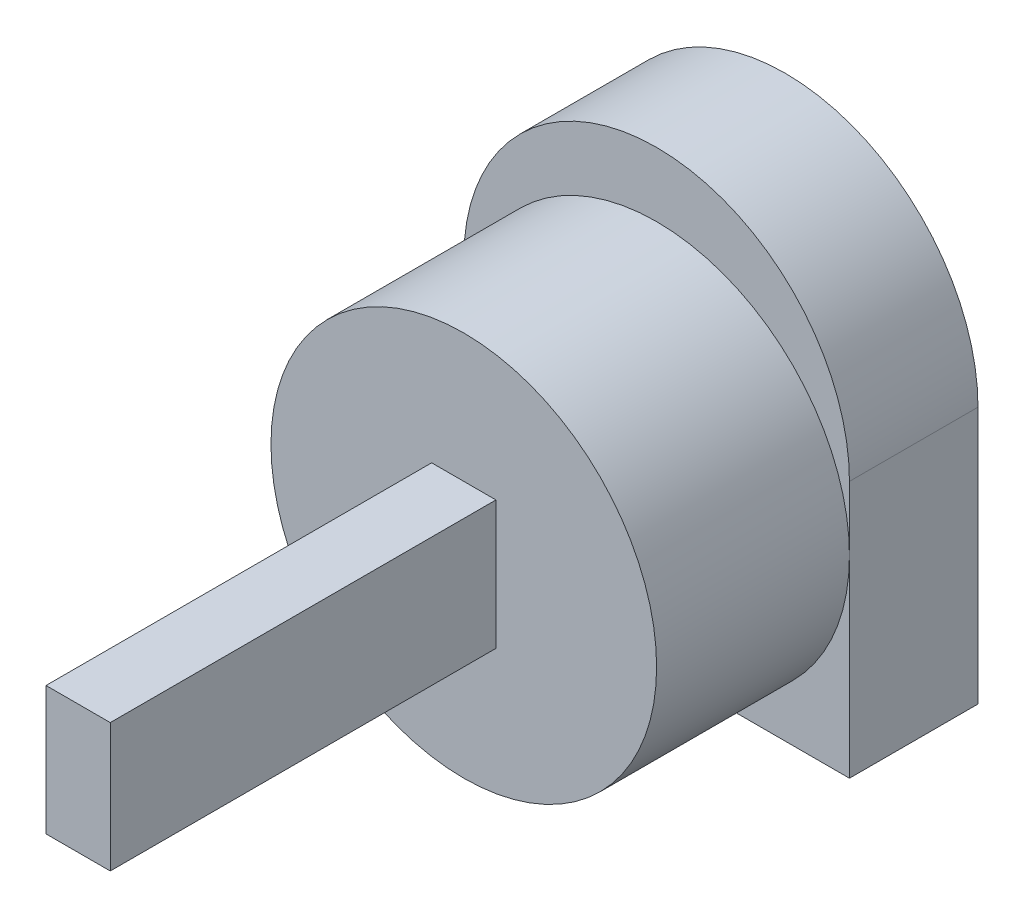
ISO-10303-21;
HEADER;
FILE_DESCRIPTION(('STEP AP214'),'2;1');
FILE_NAME('part.step','',(''),(''),'','','');
FILE_SCHEMA(('AUTOMOTIVE_DESIGN { 1 0 10303 214 1 1 1 1 }'));
ENDSEC;
DATA;
#1=APPLICATION_CONTEXT('core data for automotive mechanical design processes');
#2=APPLICATION_PROTOCOL_DEFINITION('international standard','automotive_design',2000,#1);
#3=PRODUCT_CONTEXT('',#1,'mechanical');
#4=PRODUCT('Part','Part','',(#3));
#5=PRODUCT_RELATED_PRODUCT_CATEGORY('part','',(#4));
#6=PRODUCT_DEFINITION_FORMATION('','',#4);
#7=PRODUCT_DEFINITION_CONTEXT('part definition',#1,'design');
#8=PRODUCT_DEFINITION('design','',#6,#7);
#9=PRODUCT_DEFINITION_SHAPE('','',#8);
#10=(LENGTH_UNIT() NAMED_UNIT(*) SI_UNIT(.MILLI.,.METRE.));
#11=(NAMED_UNIT(*) PLANE_ANGLE_UNIT() SI_UNIT($,.RADIAN.));
#12=(NAMED_UNIT(*) SI_UNIT($,.STERADIAN.) SOLID_ANGLE_UNIT());
#13=UNCERTAINTY_MEASURE_WITH_UNIT(LENGTH_MEASURE(1.E-05),#10,'distance_accuracy_value','');
#14=(GEOMETRIC_REPRESENTATION_CONTEXT(3) GLOBAL_UNCERTAINTY_ASSIGNED_CONTEXT((#13)) GLOBAL_UNIT_ASSIGNED_CONTEXT((#10,
#11,#12)) REPRESENTATION_CONTEXT('',''));
#15=CARTESIAN_POINT('',(0.,0.,0.));
#16=DIRECTION('',(0.,0.,1.));
#17=DIRECTION('',(1.,0.,0.));
#18=AXIS2_PLACEMENT_3D('',#15,#16,#17);
#19=CARTESIAN_POINT('',(15.,20.,10.));
#20=DIRECTION('',(0.,0.,1.));
#21=DIRECTION('',(1.,0.,0.));
#22=AXIS2_PLACEMENT_3D('',#19,#20,#21);
#23=PLANE('',#22);
#24=CARTESIAN_POINT('',(15.,15.,10.));
#25=DIRECTION('',(0.,0.,1.));
#26=DIRECTION('',(1.,0.,0.));
#27=AXIS2_PLACEMENT_3D('',#24,#25,#26);
#28=CIRCLE('',#27,15.);
#29=CARTESIAN_POINT('',(30.,15.,10.));
#30=VERTEX_POINT('',#29);
#31=CARTESIAN_POINT('',(0.,15.,10.));
#32=VERTEX_POINT('',#31);
#33=EDGE_CURVE('E50',#30,#32,#28,.T.);
#34=ORIENTED_EDGE('',*,*,#33,.F.);
#35=DIRECTION('',(0.,1.,0.));
#36=VECTOR('',#35,1.);
#37=CARTESIAN_POINT('',(30.,0.,10.));
#38=LINE('',#37,#36);
#39=CARTESIAN_POINT('',(30.,20.,10.));
#40=VERTEX_POINT('',#39);
#41=EDGE_CURVE('E154',#30,#40,#38,.T.);
#42=ORIENTED_EDGE('',*,*,#41,.T.);
#43=CARTESIAN_POINT('',(15.,20.,10.));
#44=DIRECTION('',(0.,0.,1.));
#45=DIRECTION('',(1.,0.,0.));
#46=AXIS2_PLACEMENT_3D('',#43,#44,#45);
#47=CIRCLE('',#46,15.);
#48=CARTESIAN_POINT('',(0.,20.,10.));
#49=VERTEX_POINT('',#48);
#50=EDGE_CURVE('E157',#40,#49,#47,.T.);
#51=ORIENTED_EDGE('',*,*,#50,.T.);
#52=DIRECTION('',(0.,-1.,0.));
#53=VECTOR('',#52,1.);
#54=CARTESIAN_POINT('',(0.,20.,10.));
#55=LINE('',#54,#53);
#56=EDGE_CURVE('E146',#49,#32,#55,.T.);
#57=ORIENTED_EDGE('',*,*,#56,.T.);
#58=EDGE_LOOP('',(#34,#42,#51,#57));
#59=FACE_BOUND('',#58,.T.);
#60=ADVANCED_FACE('F39',(#59),#23,.T.);
#61=CARTESIAN_POINT('',(15.,0.,10.));
#62=VERTEX_POINT('',#61);
#63=EDGE_CURVE('E11',#32,#62,#28,.T.);
#64=ORIENTED_EDGE('',*,*,#63,.F.);
#65=CARTESIAN_POINT('',(0.,0.,10.));
#66=VERTEX_POINT('',#65);
#67=EDGE_CURVE('E150',#32,#66,#55,.T.);
#68=ORIENTED_EDGE('',*,*,#67,.T.);
#69=DIRECTION('',(1.,0.,0.));
#70=VECTOR('',#69,1.);
#71=CARTESIAN_POINT('',(0.,0.,10.));
#72=LINE('',#71,#70);
#73=EDGE_CURVE('E151',#66,#62,#72,.T.);
#74=ORIENTED_EDGE('',*,*,#73,.T.);
#75=EDGE_LOOP('',(#64,#68,#74));
#76=FACE_BOUND('',#75,.T.);
#77=ADVANCED_FACE('F192',(#76),#23,.T.);
#78=CARTESIAN_POINT('',(0.,20.,10.));
#79=DIRECTION('',(1.,0.,0.));
#80=DIRECTION('',(0.,1.,0.));
#81=AXIS2_PLACEMENT_3D('',#78,#79,#80);
#82=PLANE('',#81);
#83=DIRECTION('',(0.,-1.,0.));
#84=VECTOR('',#83,1.);
#85=CARTESIAN_POINT('',(0.,20.,0.));
#86=LINE('',#85,#84);
#87=CARTESIAN_POINT('',(0.,20.,0.));
#88=VERTEX_POINT('',#87);
#89=CARTESIAN_POINT('',(0.,0.,0.));
#90=VERTEX_POINT('',#89);
#91=EDGE_CURVE('E144',#88,#90,#86,.T.);
#92=ORIENTED_EDGE('',*,*,#91,.T.);
#93=DIRECTION('',(0.,0.,-1.));
#94=VECTOR('',#93,1.);
#95=CARTESIAN_POINT('',(0.,0.,10.));
#96=LINE('',#95,#94);
#97=EDGE_CURVE('E43',#66,#90,#96,.T.);
#98=ORIENTED_EDGE('',*,*,#97,.F.);
#99=ORIENTED_EDGE('',*,*,#67,.F.);
#100=ORIENTED_EDGE('',*,*,#56,.F.);
#101=DIRECTION('',(0.,0.,-1.));
#102=VECTOR('',#101,1.);
#103=CARTESIAN_POINT('',(0.,20.,10.));
#104=LINE('',#103,#102);
#105=EDGE_CURVE('E159',#49,#88,#104,.T.);
#106=ORIENTED_EDGE('',*,*,#105,.T.);
#107=EDGE_LOOP('',(#92,#98,#99,#100,#106));
#108=FACE_BOUND('',#107,.T.);
#109=ADVANCED_FACE('F41',(#108),#82,.F.);
#110=CARTESIAN_POINT('',(0.,0.,10.));
#111=DIRECTION('',(0.,1.,0.));
#112=DIRECTION('',(0.,0.,1.));
#113=AXIS2_PLACEMENT_3D('',#110,#111,#112);
#114=PLANE('',#113);
#115=DIRECTION('',(1.,0.,0.));
#116=VECTOR('',#115,1.);
#117=CARTESIAN_POINT('',(0.,0.,0.));
#118=LINE('',#117,#116);
#119=CARTESIAN_POINT('',(30.,0.,0.));
#120=VERTEX_POINT('',#119);
#121=EDGE_CURVE('E162',#90,#120,#118,.T.);
#122=ORIENTED_EDGE('',*,*,#121,.T.);
#123=DIRECTION('',(0.,0.,-1.));
#124=VECTOR('',#123,1.);
#125=CARTESIAN_POINT('',(30.,0.,10.));
#126=LINE('',#125,#124);
#127=CARTESIAN_POINT('',(30.,0.,10.));
#128=VERTEX_POINT('',#127);
#129=EDGE_CURVE('E172',#128,#120,#126,.T.);
#130=ORIENTED_EDGE('',*,*,#129,.F.);
#131=EDGE_CURVE('E149',#62,#128,#72,.T.);
#132=ORIENTED_EDGE('',*,*,#131,.F.);
#133=ORIENTED_EDGE('',*,*,#73,.F.);
#134=ORIENTED_EDGE('',*,*,#97,.T.);
#135=EDGE_LOOP('',(#122,#130,#132,#133,#134));
#136=FACE_BOUND('',#135,.T.);
#137=ADVANCED_FACE('F190',(#136),#114,.F.);
#138=CARTESIAN_POINT('',(30.,0.,10.));
#139=DIRECTION('',(-1.,0.,0.));
#140=DIRECTION('',(0.,0.,1.));
#141=AXIS2_PLACEMENT_3D('',#138,#139,#140);
#142=PLANE('',#141);
#143=DIRECTION('',(0.,1.,0.));
#144=VECTOR('',#143,1.);
#145=CARTESIAN_POINT('',(30.,0.,0.));
#146=LINE('',#145,#144);
#147=CARTESIAN_POINT('',(30.,20.,0.));
#148=VERTEX_POINT('',#147);
#149=EDGE_CURVE('E164',#120,#148,#146,.T.);
#150=ORIENTED_EDGE('',*,*,#149,.T.);
#151=DIRECTION('',(0.,0.,-1.));
#152=VECTOR('',#151,1.);
#153=CARTESIAN_POINT('',(30.,20.,10.));
#154=LINE('',#153,#152);
#155=EDGE_CURVE('E170',#40,#148,#154,.T.);
#156=ORIENTED_EDGE('',*,*,#155,.F.);
#157=ORIENTED_EDGE('',*,*,#41,.F.);
#158=EDGE_CURVE('E155',#128,#30,#38,.T.);
#159=ORIENTED_EDGE('',*,*,#158,.F.);
#160=ORIENTED_EDGE('',*,*,#129,.T.);
#161=EDGE_LOOP('',(#150,#156,#157,#159,#160));
#162=FACE_BOUND('',#161,.T.);
#163=ADVANCED_FACE('F206',(#162),#142,.F.);
#164=CARTESIAN_POINT('',(15.,20.,10.));
#165=DIRECTION('',(0.,0.,-1.));
#166=DIRECTION('',(-1.,0.,0.));
#167=AXIS2_PLACEMENT_3D('',#164,#165,#166);
#168=CYLINDRICAL_SURFACE('',#167,15.);
#169=CARTESIAN_POINT('',(15.,20.,0.));
#170=DIRECTION('',(0.,0.,1.));
#171=DIRECTION('',(1.,0.,0.));
#172=AXIS2_PLACEMENT_3D('',#169,#170,#171);
#173=CIRCLE('',#172,15.);
#174=EDGE_CURVE('E166',#148,#88,#173,.T.);
#175=ORIENTED_EDGE('',*,*,#174,.T.);
#176=ORIENTED_EDGE('',*,*,#105,.F.);
#177=ORIENTED_EDGE('',*,*,#50,.F.);
#178=ORIENTED_EDGE('',*,*,#155,.T.);
#179=EDGE_LOOP('',(#175,#176,#177,#178));
#180=FACE_BOUND('',#179,.T.);
#181=ADVANCED_FACE('F201',(#180),#168,.T.);
#182=EDGE_CURVE('E48',#62,#30,#28,.T.);
#183=ORIENTED_EDGE('',*,*,#182,.F.);
#184=ORIENTED_EDGE('',*,*,#131,.T.);
#185=ORIENTED_EDGE('',*,*,#158,.T.);
#186=EDGE_LOOP('',(#183,#184,#185));
#187=FACE_BOUND('',#186,.T.);
#188=ADVANCED_FACE('F188',(#187),#23,.T.);
#189=CARTESIAN_POINT('',(15.,20.,0.));
#190=DIRECTION('',(0.,0.,1.));
#191=DIRECTION('',(1.,0.,0.));
#192=AXIS2_PLACEMENT_3D('',#189,#190,#191);
#193=PLANE('',#192);
#194=ORIENTED_EDGE('',*,*,#91,.F.);
#195=ORIENTED_EDGE('',*,*,#174,.F.);
#196=ORIENTED_EDGE('',*,*,#149,.F.);
#197=ORIENTED_EDGE('',*,*,#121,.F.);
#198=EDGE_LOOP('',(#194,#195,#196,#197));
#199=FACE_BOUND('',#198,.T.);
#200=ADVANCED_FACE('F205',(#199),#193,.F.);
#201=CARTESIAN_POINT('',(15.,15.,25.));
#202=DIRECTION('',(0.,0.,-1.));
#203=DIRECTION('',(-1.,0.,0.));
#204=AXIS2_PLACEMENT_3D('',#201,#202,#203);
#205=CYLINDRICAL_SURFACE('',#204,15.);
#206=CARTESIAN_POINT('',(15.,15.,25.));
#207=DIRECTION('',(0.,0.,1.));
#208=DIRECTION('',(1.,0.,0.));
#209=AXIS2_PLACEMENT_3D('',#206,#207,#208);
#210=CIRCLE('',#209,15.);
#211=CARTESIAN_POINT('',(30.,15.,25.));
#212=VERTEX_POINT('',#211);
#213=EDGE_CURVE('E138',#212,#212,#210,.T.);
#214=ORIENTED_EDGE('',*,*,#213,.F.);
#215=EDGE_LOOP('',(#214));
#216=FACE_BOUND('',#215,.T.);
#217=ORIENTED_EDGE('',*,*,#33,.T.);
#218=ORIENTED_EDGE('',*,*,#63,.T.);
#219=ORIENTED_EDGE('',*,*,#182,.T.);
#220=EDGE_LOOP('',(#217,#218,#219));
#221=FACE_BOUND('',#220,.T.);
#222=ADVANCED_FACE('F184',(#216,#221),#205,.T.);
#223=CARTESIAN_POINT('',(15.,15.,25.));
#224=DIRECTION('',(0.,0.,1.));
#225=DIRECTION('',(1.,0.,0.));
#226=AXIS2_PLACEMENT_3D('',#223,#224,#225);
#227=PLANE('',#226);
#228=DIRECTION('',(0.,-1.,0.));
#229=VECTOR('',#228,1.);
#230=CARTESIAN_POINT('',(12.5,20.,25.));
#231=LINE('',#230,#229);
#232=CARTESIAN_POINT('',(12.5,20.,25.));
#233=VERTEX_POINT('',#232);
#234=CARTESIAN_POINT('',(12.5,10.,25.));
#235=VERTEX_POINT('',#234);
#236=EDGE_CURVE('E57',#233,#235,#231,.T.);
#237=ORIENTED_EDGE('',*,*,#236,.F.);
#238=DIRECTION('',(-1.,0.,0.));
#239=VECTOR('',#238,1.);
#240=CARTESIAN_POINT('',(12.5,20.,25.));
#241=LINE('',#240,#239);
#242=CARTESIAN_POINT('',(17.5,20.,25.));
#243=VERTEX_POINT('',#242);
#244=EDGE_CURVE('E61',#243,#233,#241,.T.);
#245=ORIENTED_EDGE('',*,*,#244,.F.);
#246=DIRECTION('',(0.,1.,0.));
#247=VECTOR('',#246,1.);
#248=CARTESIAN_POINT('',(17.5,20.,25.));
#249=LINE('',#248,#247);
#250=CARTESIAN_POINT('',(17.5,10.,25.));
#251=VERTEX_POINT('',#250);
#252=EDGE_CURVE('E363',#251,#243,#249,.T.);
#253=ORIENTED_EDGE('',*,*,#252,.F.);
#254=DIRECTION('',(1.,0.,0.));
#255=VECTOR('',#254,1.);
#256=CARTESIAN_POINT('',(12.5,10.,25.));
#257=LINE('',#256,#255);
#258=EDGE_CURVE('E369',#235,#251,#257,.T.);
#259=ORIENTED_EDGE('',*,*,#258,.F.);
#260=EDGE_LOOP('',(#237,#245,#253,#259));
#261=FACE_BOUND('',#260,.T.);
#262=ORIENTED_EDGE('',*,*,#213,.T.);
#263=EDGE_LOOP('',(#262));
#264=FACE_BOUND('',#263,.T.);
#265=ADVANCED_FACE('F228',(#261,#264),#227,.T.);
#266=CARTESIAN_POINT('',(12.5,20.,55.));
#267=DIRECTION('',(1.,0.,0.));
#268=DIRECTION('',(0.,0.,-1.));
#269=AXIS2_PLACEMENT_3D('',#266,#267,#268);
#270=PLANE('',#269);
#271=ORIENTED_EDGE('',*,*,#236,.T.);
#272=DIRECTION('',(0.,0.,-1.));
#273=VECTOR('',#272,1.);
#274=CARTESIAN_POINT('',(12.5,10.,55.));
#275=LINE('',#274,#273);
#276=CARTESIAN_POINT('',(12.5,10.,55.));
#277=VERTEX_POINT('',#276);
#278=EDGE_CURVE('E119',#277,#235,#275,.T.);
#279=ORIENTED_EDGE('',*,*,#278,.F.);
#280=DIRECTION('',(0.,-1.,0.));
#281=VECTOR('',#280,1.);
#282=CARTESIAN_POINT('',(12.5,20.,55.));
#283=LINE('',#282,#281);
#284=CARTESIAN_POINT('',(12.5,20.,55.));
#285=VERTEX_POINT('',#284);
#286=EDGE_CURVE('E125',#285,#277,#283,.T.);
#287=ORIENTED_EDGE('',*,*,#286,.F.);
#288=DIRECTION('',(0.,0.,-1.));
#289=VECTOR('',#288,1.);
#290=CARTESIAN_POINT('',(12.5,20.,55.));
#291=LINE('',#290,#289);
#292=EDGE_CURVE('E361',#285,#233,#291,.T.);
#293=ORIENTED_EDGE('',*,*,#292,.T.);
#294=EDGE_LOOP('',(#271,#279,#287,#293));
#295=FACE_BOUND('',#294,.T.);
#296=ADVANCED_FACE('F135',(#295),#270,.F.);
#297=CARTESIAN_POINT('',(12.5,10.,55.));
#298=DIRECTION('',(0.,1.,0.));
#299=DIRECTION('',(0.,0.,1.));
#300=AXIS2_PLACEMENT_3D('',#297,#298,#299);
#301=PLANE('',#300);
#302=ORIENTED_EDGE('',*,*,#258,.T.);
#303=DIRECTION('',(0.,0.,-1.));
#304=VECTOR('',#303,1.);
#305=CARTESIAN_POINT('',(17.5,10.,55.));
#306=LINE('',#305,#304);
#307=CARTESIAN_POINT('',(17.5,10.,55.));
#308=VERTEX_POINT('',#307);
#309=EDGE_CURVE('E121',#308,#251,#306,.T.);
#310=ORIENTED_EDGE('',*,*,#309,.F.);
#311=DIRECTION('',(1.,0.,0.));
#312=VECTOR('',#311,1.);
#313=CARTESIAN_POINT('',(12.5,10.,55.));
#314=LINE('',#313,#312);
#315=EDGE_CURVE('E114',#277,#308,#314,.T.);
#316=ORIENTED_EDGE('',*,*,#315,.F.);
#317=ORIENTED_EDGE('',*,*,#278,.T.);
#318=EDGE_LOOP('',(#302,#310,#316,#317));
#319=FACE_BOUND('',#318,.T.);
#320=ADVANCED_FACE('F117',(#319),#301,.F.);
#321=CARTESIAN_POINT('',(17.5,20.,55.));
#322=DIRECTION('',(-1.,0.,0.));
#323=DIRECTION('',(0.,0.,1.));
#324=AXIS2_PLACEMENT_3D('',#321,#322,#323);
#325=PLANE('',#324);
#326=ORIENTED_EDGE('',*,*,#252,.T.);
#327=DIRECTION('',(0.,0.,-1.));
#328=VECTOR('',#327,1.);
#329=CARTESIAN_POINT('',(17.5,20.,55.));
#330=LINE('',#329,#328);
#331=CARTESIAN_POINT('',(17.5,20.,55.));
#332=VERTEX_POINT('',#331);
#333=EDGE_CURVE('E139',#332,#243,#330,.T.);
#334=ORIENTED_EDGE('',*,*,#333,.F.);
#335=DIRECTION('',(0.,1.,0.));
#336=VECTOR('',#335,1.);
#337=CARTESIAN_POINT('',(17.5,20.,55.));
#338=LINE('',#337,#336);
#339=EDGE_CURVE('E124',#308,#332,#338,.T.);
#340=ORIENTED_EDGE('',*,*,#339,.F.);
#341=ORIENTED_EDGE('',*,*,#309,.T.);
#342=EDGE_LOOP('',(#326,#334,#340,#341));
#343=FACE_BOUND('',#342,.T.);
#344=ADVANCED_FACE('F240',(#343),#325,.F.);
#345=CARTESIAN_POINT('',(12.5,20.,55.));
#346=DIRECTION('',(0.,-1.,0.));
#347=DIRECTION('',(1.,0.,0.));
#348=AXIS2_PLACEMENT_3D('',#345,#346,#347);
#349=PLANE('',#348);
#350=ORIENTED_EDGE('',*,*,#244,.T.);
#351=ORIENTED_EDGE('',*,*,#292,.F.);
#352=DIRECTION('',(-1.,0.,0.));
#353=VECTOR('',#352,1.);
#354=CARTESIAN_POINT('',(12.5,20.,55.));
#355=LINE('',#354,#353);
#356=EDGE_CURVE('E130',#332,#285,#355,.T.);
#357=ORIENTED_EDGE('',*,*,#356,.F.);
#358=ORIENTED_EDGE('',*,*,#333,.T.);
#359=EDGE_LOOP('',(#350,#351,#357,#358));
#360=FACE_BOUND('',#359,.T.);
#361=ADVANCED_FACE('F243',(#360),#349,.F.);
#362=CARTESIAN_POINT('',(0.,0.,55.));
#363=DIRECTION('',(0.,0.,1.));
#364=DIRECTION('',(1.,0.,0.));
#365=AXIS2_PLACEMENT_3D('',#362,#363,#364);
#366=PLANE('',#365);
#367=ORIENTED_EDGE('',*,*,#286,.T.);
#368=ORIENTED_EDGE('',*,*,#315,.T.);
#369=ORIENTED_EDGE('',*,*,#339,.T.);
#370=ORIENTED_EDGE('',*,*,#356,.T.);
#371=EDGE_LOOP('',(#367,#368,#369,#370));
#372=FACE_BOUND('',#371,.T.);
#373=ADVANCED_FACE('F128',(#372),#366,.T.);
#374=CLOSED_SHELL('',(#60,#77,#109,#137,#163,#181,#188,#200,#222,#265,#296,#320,#344,#361,#373));
#375=MANIFOLD_SOLID_BREP('B2',#374);
#376=ADVANCED_BREP_SHAPE_REPRESENTATION('',(#18,#375),#14);
#377=SHAPE_DEFINITION_REPRESENTATION(#9,#376);
ENDSEC;
END-ISO-10303-21;
